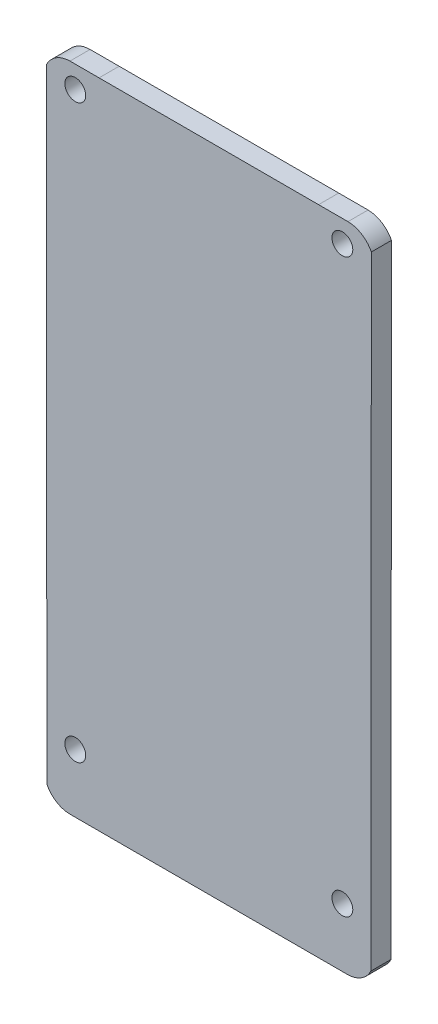
ISO-10303-21;
HEADER;
FILE_DESCRIPTION(('STEP AP214'),'2;1');
FILE_NAME('part.step','',(''),(''),'','','');
FILE_SCHEMA(('AUTOMOTIVE_DESIGN { 1 0 10303 214 1 1 1 1 }'));
ENDSEC;
DATA;
#1=APPLICATION_CONTEXT('core data for automotive mechanical design processes');
#2=APPLICATION_PROTOCOL_DEFINITION('international standard','automotive_design',2000,#1);
#3=PRODUCT_CONTEXT('',#1,'mechanical');
#4=PRODUCT('Part','Part','',(#3));
#5=PRODUCT_RELATED_PRODUCT_CATEGORY('part','',(#4));
#6=PRODUCT_DEFINITION_FORMATION('','',#4);
#7=PRODUCT_DEFINITION_CONTEXT('part definition',#1,'design');
#8=PRODUCT_DEFINITION('design','',#6,#7);
#9=PRODUCT_DEFINITION_SHAPE('','',#8);
#10=(LENGTH_UNIT() NAMED_UNIT(*) SI_UNIT(.MILLI.,.METRE.));
#11=(NAMED_UNIT(*) PLANE_ANGLE_UNIT() SI_UNIT($,.RADIAN.));
#12=(NAMED_UNIT(*) SI_UNIT($,.STERADIAN.) SOLID_ANGLE_UNIT());
#13=UNCERTAINTY_MEASURE_WITH_UNIT(LENGTH_MEASURE(1.E-05),#10,'distance_accuracy_value','');
#14=(GEOMETRIC_REPRESENTATION_CONTEXT(3) GLOBAL_UNCERTAINTY_ASSIGNED_CONTEXT((#13)) GLOBAL_UNIT_ASSIGNED_CONTEXT((#10,
#11,#12)) REPRESENTATION_CONTEXT('',''));
#15=CARTESIAN_POINT('',(0.,0.,0.));
#16=DIRECTION('',(0.,0.,1.));
#17=DIRECTION('',(1.,0.,0.));
#18=AXIS2_PLACEMENT_3D('',#15,#16,#17);
#19=CARTESIAN_POINT('',(0.00942545403528026,44.5705657455995,2.75));
#20=DIRECTION('',(0.000211472609038053,0.999999977639668,0.));
#21=DIRECTION('',(-0.999999977639668,0.000211472609038053,0.));
#22=AXIS2_PLACEMENT_3D('',#19,#20,#21);
#23=PLANE('',#22);
#24=DIRECTION('',(0.999999977639668,-0.000211472609038053,0.));
#25=VECTOR('',#24,1.);
#26=CARTESIAN_POINT('',(0.00942545403528026,44.5705657455995,0.));
#27=LINE('',#26,#25);
#28=CARTESIAN_POINT('',(-15.,44.5737398280314,0.));
#29=VERTEX_POINT('',#28);
#30=CARTESIAN_POINT('',(15.0000089381834,44.5673956477282,0.));
#31=VERTEX_POINT('',#30);
#32=EDGE_CURVE('E151',#29,#31,#27,.T.);
#33=ORIENTED_EDGE('',*,*,#32,.F.);
#34=DIRECTION('',(0.,0.,-1.));
#35=VECTOR('',#34,1.);
#36=CARTESIAN_POINT('',(-15.,44.5737398280314,2.75));
#37=LINE('',#36,#35);
#38=CARTESIAN_POINT('',(-15.,44.5737398280314,2.75));
#39=VERTEX_POINT('',#38);
#40=EDGE_CURVE('E11',#39,#29,#37,.T.);
#41=ORIENTED_EDGE('',*,*,#40,.F.);
#42=DIRECTION('',(0.999999977639668,-0.000211472609038053,0.));
#43=VECTOR('',#42,1.);
#44=CARTESIAN_POINT('',(0.00942545403528026,44.5705657455995,2.75));
#45=LINE('',#44,#43);
#46=CARTESIAN_POINT('',(15.0000089381834,44.5673956477282,2.75));
#47=VERTEX_POINT('',#46);
#48=EDGE_CURVE('E180',#39,#47,#45,.T.);
#49=ORIENTED_EDGE('',*,*,#48,.T.);
#50=DIRECTION('',(0.,0.,-1.));
#51=VECTOR('',#50,1.);
#52=CARTESIAN_POINT('',(15.0000089381834,44.5673956477282,2.75));
#53=LINE('',#52,#51);
#54=EDGE_CURVE('E95',#47,#31,#53,.T.);
#55=ORIENTED_EDGE('',*,*,#54,.T.);
#56=EDGE_LOOP('',(#33,#41,#49,#55));
#57=FACE_BOUND('',#56,.T.);
#58=ADVANCED_FACE('F33',(#57),#23,.T.);
#59=CARTESIAN_POINT('',(0.00108410777632727,44.5733749736325,2.75));
#60=DIRECTION('',(-2.43218687534414E-05,-0.999999999704223,0.));
#61=DIRECTION('',(0.999999999704223,-2.43218687534414E-05,0.));
#62=AXIS2_PLACEMENT_3D('',#59,#60,#61);
#63=PLANE('',#62);
#64=DIRECTION('',(-0.999999999704223,2.43218687534414E-05,0.));
#65=VECTOR('',#64,1.);
#66=CARTESIAN_POINT('',(0.00108410777632727,44.5733749736325,0.));
#67=LINE('',#66,#65);
#68=CARTESIAN_POINT('',(-18.975450835992,44.5738365184249,0.));
#69=VERTEX_POINT('',#68);
#70=EDGE_CURVE('E154',#29,#69,#67,.T.);
#71=ORIENTED_EDGE('',*,*,#70,.T.);
#72=DIRECTION('',(0.,0.,-1.));
#73=VECTOR('',#72,1.);
#74=CARTESIAN_POINT('',(-18.975450835992,44.5738365184249,2.75));
#75=LINE('',#74,#73);
#76=CARTESIAN_POINT('',(-18.975450835992,44.5738365184249,2.75));
#77=VERTEX_POINT('',#76);
#78=EDGE_CURVE('E41',#77,#69,#75,.T.);
#79=ORIENTED_EDGE('',*,*,#78,.F.);
#80=DIRECTION('',(-0.999999999704223,2.43218687534414E-05,0.));
#81=VECTOR('',#80,1.);
#82=CARTESIAN_POINT('',(0.00108410777632727,44.5733749736325,2.75));
#83=LINE('',#82,#81);
#84=EDGE_CURVE('E222',#39,#77,#83,.T.);
#85=ORIENTED_EDGE('',*,*,#84,.F.);
#86=ORIENTED_EDGE('',*,*,#40,.T.);
#87=EDGE_LOOP('',(#71,#79,#85,#86));
#88=FACE_BOUND('',#87,.T.);
#89=ADVANCED_FACE('F285',(#88),#63,.F.);
#90=CARTESIAN_POINT('',(-18.9392064102592,40.9468254740889,2.75));
#91=DIRECTION('',(0.,0.,-1.));
#92=DIRECTION('',(-1.,0.,0.));
#93=AXIS2_PLACEMENT_3D('',#90,#91,#92);
#94=CYLINDRICAL_SURFACE('',#93,3.62719213361129);
#95=CARTESIAN_POINT('',(-18.9392064102592,40.9468254740889,0.));
#96=DIRECTION('',(0.,0.,1.));
#97=DIRECTION('',(1.,0.,0.));
#98=AXIS2_PLACEMENT_3D('',#95,#96,#97);
#99=CIRCLE('',#98,3.62719213361129);
#100=CARTESIAN_POINT('',(-22.1812519703787,42.573375,0.));
#101=VERTEX_POINT('',#100);
#102=EDGE_CURVE('E157',#69,#101,#99,.T.);
#103=ORIENTED_EDGE('',*,*,#102,.T.);
#104=DIRECTION('',(0.,0.,-1.));
#105=VECTOR('',#104,1.);
#106=CARTESIAN_POINT('',(-22.1812519703787,42.573375,2.75));
#107=LINE('',#106,#105);
#108=CARTESIAN_POINT('',(-22.1812519703787,42.573375,2.75));
#109=VERTEX_POINT('',#108);
#110=EDGE_CURVE('E196',#109,#101,#107,.T.);
#111=ORIENTED_EDGE('',*,*,#110,.F.);
#112=CARTESIAN_POINT('',(-18.9392064102592,40.9468254740889,2.75));
#113=DIRECTION('',(0.,0.,1.));
#114=DIRECTION('',(1.,0.,0.));
#115=AXIS2_PLACEMENT_3D('',#112,#113,#114);
#116=CIRCLE('',#115,3.62719213361129);
#117=EDGE_CURVE('E204',#77,#109,#116,.T.);
#118=ORIENTED_EDGE('',*,*,#117,.F.);
#119=ORIENTED_EDGE('',*,*,#78,.T.);
#120=EDGE_LOOP('',(#103,#111,#118,#119));
#121=FACE_BOUND('',#120,.T.);
#122=ADVANCED_FACE('F202',(#121),#94,.T.);
#123=CARTESIAN_POINT('',(-22.1603076453313,-0.0108991569226361,2.75));
#124=DIRECTION('',(-0.999999879050475,-0.000491832323757672,0.));
#125=DIRECTION('',(0.000491832323757672,-0.999999879050475,0.));
#126=AXIS2_PLACEMENT_3D('',#123,#124,#125);
#127=PLANE('',#126);
#128=DIRECTION('',(-0.000491832323757672,0.999999879050475,0.));
#129=VECTOR('',#128,1.);
#130=CARTESIAN_POINT('',(-22.1603076453313,-0.0108991569226361,0.));
#131=LINE('',#130,#129);
#132=CARTESIAN_POINT('',(-22.1393740414006,-42.5733749999999,0.));
#133=VERTEX_POINT('',#132);
#134=EDGE_CURVE('E160',#133,#101,#131,.T.);
#135=ORIENTED_EDGE('',*,*,#134,.F.);
#136=DIRECTION('',(0.,0.,-1.));
#137=VECTOR('',#136,1.);
#138=CARTESIAN_POINT('',(-22.1393740414006,-42.5733749999999,2.75));
#139=LINE('',#138,#137);
#140=CARTESIAN_POINT('',(-22.1393740414006,-42.5733749999999,2.75));
#141=VERTEX_POINT('',#140);
#142=EDGE_CURVE('E194',#141,#133,#139,.T.);
#143=ORIENTED_EDGE('',*,*,#142,.F.);
#144=DIRECTION('',(-0.000491832323757672,0.999999879050475,0.));
#145=VECTOR('',#144,1.);
#146=CARTESIAN_POINT('',(-22.1603076453313,-0.0108991569226361,2.75));
#147=LINE('',#146,#145);
#148=EDGE_CURVE('E217',#141,#109,#147,.T.);
#149=ORIENTED_EDGE('',*,*,#148,.T.);
#150=ORIENTED_EDGE('',*,*,#110,.T.);
#151=EDGE_LOOP('',(#135,#143,#149,#150));
#152=FACE_BOUND('',#151,.T.);
#153=ADVANCED_FACE('F213',(#152),#127,.T.);
#154=CARTESIAN_POINT('',(-18.9484000676842,-41.0146668184599,2.75));
#155=DIRECTION('',(0.,0.,-1.));
#156=DIRECTION('',(-1.,0.,0.));
#157=AXIS2_PLACEMENT_3D('',#154,#155,#156);
#158=CYLINDRICAL_SURFACE('',#157,3.55132173931556);
#159=CARTESIAN_POINT('',(-18.9484000676842,-41.0146668184599,0.));
#160=DIRECTION('',(0.,0.,1.));
#161=DIRECTION('',(1.,0.,0.));
#162=AXIS2_PLACEMENT_3D('',#159,#160,#161);
#163=CIRCLE('',#162,3.55132173931556);
#164=CARTESIAN_POINT('',(-19.0263549543839,-44.5651328627666,0.));
#165=VERTEX_POINT('',#164);
#166=EDGE_CURVE('E163',#133,#165,#163,.T.);
#167=ORIENTED_EDGE('',*,*,#166,.T.);
#168=DIRECTION('',(0.,0.,-1.));
#169=VECTOR('',#168,1.);
#170=CARTESIAN_POINT('',(-19.0263549543839,-44.5651328627666,2.75));
#171=LINE('',#170,#169);
#172=CARTESIAN_POINT('',(-19.0263549543839,-44.5651328627666,2.75));
#173=VERTEX_POINT('',#172);
#174=EDGE_CURVE('E191',#173,#165,#171,.T.);
#175=ORIENTED_EDGE('',*,*,#174,.F.);
#176=CARTESIAN_POINT('',(-18.9484000676842,-41.0146668184599,2.75));
#177=DIRECTION('',(0.,0.,1.));
#178=DIRECTION('',(1.,0.,0.));
#179=AXIS2_PLACEMENT_3D('',#176,#177,#178);
#180=CIRCLE('',#179,3.55132173931556);
#181=EDGE_CURVE('E218',#141,#173,#180,.T.);
#182=ORIENTED_EDGE('',*,*,#181,.F.);
#183=ORIENTED_EDGE('',*,*,#142,.T.);
#184=EDGE_LOOP('',(#167,#175,#182,#183));
#185=FACE_BOUND('',#184,.T.);
#186=ADVANCED_FACE('F296',(#185),#158,.T.);
#187=CARTESIAN_POINT('',(-0.0193142943323028,-44.57336889219,2.75));
#188=DIRECTION('',(0.000433314622589495,0.999999906119215,0.));
#189=DIRECTION('',(-0.999999906119215,0.000433314622589495,0.));
#190=AXIS2_PLACEMENT_3D('',#187,#188,#189);
#191=PLANE('',#190);
#192=DIRECTION('',(0.999999906119215,-0.000433314622589495,0.));
#193=VECTOR('',#192,1.);
#194=CARTESIAN_POINT('',(-0.0193142943323028,-44.57336889219,0.));
#195=LINE('',#194,#193);
#196=CARTESIAN_POINT('',(-15.0000105699398,-44.5668775368278,0.));
#197=VERTEX_POINT('',#196);
#198=EDGE_CURVE('E165',#165,#197,#195,.T.);
#199=ORIENTED_EDGE('',*,*,#198,.T.);
#200=DIRECTION('',(0.,0.,-1.));
#201=VECTOR('',#200,1.);
#202=CARTESIAN_POINT('',(-15.0000105699398,-44.5668775368278,2.75));
#203=LINE('',#202,#201);
#204=CARTESIAN_POINT('',(-15.0000105699398,-44.5668775368278,2.75));
#205=VERTEX_POINT('',#204);
#206=EDGE_CURVE('E189',#205,#197,#203,.T.);
#207=ORIENTED_EDGE('',*,*,#206,.F.);
#208=DIRECTION('',(0.999999906119215,-0.000433314622589495,0.));
#209=VECTOR('',#208,1.);
#210=CARTESIAN_POINT('',(-0.0193142943323028,-44.57336889219,2.75));
#211=LINE('',#210,#209);
#212=EDGE_CURVE('E220',#173,#205,#211,.T.);
#213=ORIENTED_EDGE('',*,*,#212,.F.);
#214=ORIENTED_EDGE('',*,*,#174,.T.);
#215=EDGE_LOOP('',(#199,#207,#213,#214));
#216=FACE_BOUND('',#215,.T.);
#217=ADVANCED_FACE('F299',(#216),#191,.F.);
#218=CARTESIAN_POINT('',(-0.00942534446911136,-44.5700476350673,2.75));
#219=DIRECTION('',(-0.000211472609038491,-0.999999977639668,0.));
#220=DIRECTION('',(0.999999977639668,-0.000211472609038491,0.));
#221=AXIS2_PLACEMENT_3D('',#218,#219,#220);
#222=PLANE('',#221);
#223=DIRECTION('',(-0.999999977639668,0.000211472609038491,0.));
#224=VECTOR('',#223,1.);
#225=CARTESIAN_POINT('',(-0.00942534446911136,-44.5700476350673,0.));
#226=LINE('',#225,#224);
#227=CARTESIAN_POINT('',(15.0000000058739,-44.5732217174773,0.));
#228=VERTEX_POINT('',#227);
#229=EDGE_CURVE('E168',#228,#197,#226,.T.);
#230=ORIENTED_EDGE('',*,*,#229,.F.);
#231=DIRECTION('',(0.,0.,-1.));
#232=VECTOR('',#231,1.);
#233=CARTESIAN_POINT('',(15.0000000058739,-44.5732217174773,2.75));
#234=LINE('',#233,#232);
#235=CARTESIAN_POINT('',(15.0000000058739,-44.5732217174773,2.75));
#236=VERTEX_POINT('',#235);
#237=EDGE_CURVE('E187',#236,#228,#234,.T.);
#238=ORIENTED_EDGE('',*,*,#237,.F.);
#239=DIRECTION('',(-0.999999977639668,0.000211472609038491,0.));
#240=VECTOR('',#239,1.);
#241=CARTESIAN_POINT('',(-0.00942534446911136,-44.5700476350673,2.75));
#242=LINE('',#241,#240);
#243=EDGE_CURVE('E227',#236,#205,#242,.T.);
#244=ORIENTED_EDGE('',*,*,#243,.T.);
#245=ORIENTED_EDGE('',*,*,#206,.T.);
#246=EDGE_LOOP('',(#230,#238,#244,#245));
#247=FACE_BOUND('',#246,.T.);
#248=ADVANCED_FACE('F303',(#247),#222,.T.);
#249=CARTESIAN_POINT('',(0.00045548795726477,-44.5733749953454,2.75));
#250=DIRECTION('',(-1.02188348378052E-05,0.999999999947788,0.));
#251=DIRECTION('',(-0.999999999947788,-1.02188348378052E-05,0.));
#252=AXIS2_PLACEMENT_3D('',#249,#250,#251);
#253=PLANE('',#252);
#254=DIRECTION('',(0.999999999947788,1.02188348378052E-05,0.));
#255=VECTOR('',#254,1.);
#256=CARTESIAN_POINT('',(0.00045548795726477,-44.5733749953454,0.));
#257=LINE('',#256,#255);
#258=CARTESIAN_POINT('',(19.026379978421,-44.5731805725654,0.));
#259=VERTEX_POINT('',#258);
#260=EDGE_CURVE('E171',#228,#259,#257,.T.);
#261=ORIENTED_EDGE('',*,*,#260,.T.);
#262=DIRECTION('',(0.,0.,-1.));
#263=VECTOR('',#262,1.);
#264=CARTESIAN_POINT('',(19.026379978421,-44.5731805725654,2.75));
#265=LINE('',#264,#263);
#266=CARTESIAN_POINT('',(19.026379978421,-44.5731805725654,2.75));
#267=VERTEX_POINT('',#266);
#268=EDGE_CURVE('E184',#267,#259,#265,.T.);
#269=ORIENTED_EDGE('',*,*,#268,.F.);
#270=DIRECTION('',(0.999999999947788,1.02188348378052E-05,0.));
#271=VECTOR('',#270,1.);
#272=CARTESIAN_POINT('',(0.00045548795726477,-44.5733749953454,2.75));
#273=LINE('',#272,#271);
#274=EDGE_CURVE('E146',#236,#267,#273,.T.);
#275=ORIENTED_EDGE('',*,*,#274,.F.);
#276=ORIENTED_EDGE('',*,*,#237,.T.);
#277=EDGE_LOOP('',(#261,#269,#275,#276));
#278=FACE_BOUND('',#277,.T.);
#279=ADVANCED_FACE('F233',(#278),#253,.F.);
#280=CARTESIAN_POINT('',(18.9499074828976,-41.0226823511819,2.75));
#281=DIRECTION('',(0.,0.,-1.));
#282=DIRECTION('',(-1.,0.,0.));
#283=AXIS2_PLACEMENT_3D('',#280,#281,#282);
#284=CYLINDRICAL_SURFACE('',#283,3.55132167827963);
#285=CARTESIAN_POINT('',(18.9499074828976,-41.0226823511819,0.));
#286=DIRECTION('',(0.,0.,1.));
#287=DIRECTION('',(1.,0.,0.));
#288=AXIS2_PLACEMENT_3D('',#285,#286,#287);
#289=CIRCLE('',#288,3.55132167827963);
#290=CARTESIAN_POINT('',(22.1447843148772,-42.5733749999999,0.));
#291=VERTEX_POINT('',#290);
#292=EDGE_CURVE('E173',#259,#291,#289,.T.);
#293=ORIENTED_EDGE('',*,*,#292,.T.);
#294=DIRECTION('',(0.,0.,-1.));
#295=VECTOR('',#294,1.);
#296=CARTESIAN_POINT('',(22.1447843148772,-42.5733749999999,2.75));
#297=LINE('',#296,#295);
#298=CARTESIAN_POINT('',(22.1447843148772,-42.5733749999999,2.75));
#299=VERTEX_POINT('',#298);
#300=EDGE_CURVE('E135',#299,#291,#297,.T.);
#301=ORIENTED_EDGE('',*,*,#300,.F.);
#302=CARTESIAN_POINT('',(18.9499074828976,-41.0226823511819,2.75));
#303=DIRECTION('',(0.,0.,1.));
#304=DIRECTION('',(1.,0.,0.));
#305=AXIS2_PLACEMENT_3D('',#302,#303,#304);
#306=CIRCLE('',#305,3.55132167827963);
#307=EDGE_CURVE('E143',#267,#299,#306,.T.);
#308=ORIENTED_EDGE('',*,*,#307,.F.);
#309=ORIENTED_EDGE('',*,*,#268,.T.);
#310=EDGE_LOOP('',(#293,#301,#308,#309));
#311=FACE_BOUND('',#310,.T.);
#312=ADVANCED_FACE('F237',(#311),#284,.T.);
#313=CARTESIAN_POINT('',(22.1786781618883,-0.0176643913067051,2.75));
#314=DIRECTION('',(0.999999682827275,-0.000796458002370779,0.));
#315=DIRECTION('',(0.000796458002370779,0.999999682827275,0.));
#316=AXIS2_PLACEMENT_3D('',#313,#314,#315);
#317=PLANE('',#316);
#318=DIRECTION('',(-0.000796458002370779,-0.999999682827275,0.));
#319=VECTOR('',#318,1.);
#320=CARTESIAN_POINT('',(22.1786781618883,-0.0176643913067051,0.));
#321=LINE('',#320,#319);
#322=CARTESIAN_POINT('',(22.2126001467999,42.573375,0.));
#323=VERTEX_POINT('',#322);
#324=EDGE_CURVE('E134',#323,#291,#321,.T.);
#325=ORIENTED_EDGE('',*,*,#324,.F.);
#326=DIRECTION('',(0.,0.,-1.));
#327=VECTOR('',#326,1.);
#328=CARTESIAN_POINT('',(22.2126001467999,42.573375,2.75));
#329=LINE('',#328,#327);
#330=CARTESIAN_POINT('',(22.2126001467999,42.573375,2.75));
#331=VERTEX_POINT('',#330);
#332=EDGE_CURVE('E128',#331,#323,#329,.T.);
#333=ORIENTED_EDGE('',*,*,#332,.F.);
#334=DIRECTION('',(-0.000796458002370779,-0.999999682827275,0.));
#335=VECTOR('',#334,1.);
#336=CARTESIAN_POINT('',(22.1786781618883,-0.0176643913067051,2.75));
#337=LINE('',#336,#335);
#338=EDGE_CURVE('E132',#331,#299,#337,.T.);
#339=ORIENTED_EDGE('',*,*,#338,.T.);
#340=ORIENTED_EDGE('',*,*,#300,.T.);
#341=EDGE_LOOP('',(#325,#333,#339,#340));
#342=FACE_BOUND('',#341,.T.);
#343=ADVANCED_FACE('F130',(#342),#317,.T.);
#344=CARTESIAN_POINT('',(18.9745936732691,40.9388019134865,2.75));
#345=DIRECTION('',(0.,0.,-1.));
#346=DIRECTION('',(-1.,0.,0.));
#347=AXIS2_PLACEMENT_3D('',#344,#345,#346);
#348=CYLINDRICAL_SURFACE('',#347,3.6271910754441);
#349=CARTESIAN_POINT('',(18.9745936732691,40.9388019134865,0.));
#350=DIRECTION('',(0.,0.,1.));
#351=DIRECTION('',(1.,0.,0.));
#352=AXIS2_PLACEMENT_3D('',#349,#350,#351);
#353=CIRCLE('',#352,3.6271910754441);
#354=CARTESIAN_POINT('',(19.0123740493778,44.5657962257184,0.));
#355=VERTEX_POINT('',#354);
#356=EDGE_CURVE('E88',#323,#355,#353,.T.);
#357=ORIENTED_EDGE('',*,*,#356,.T.);
#358=DIRECTION('',(0.,0.,-1.));
#359=VECTOR('',#358,1.);
#360=CARTESIAN_POINT('',(19.0123740493778,44.5657962257184,2.75));
#361=LINE('',#360,#359);
#362=CARTESIAN_POINT('',(19.0123740493778,44.5657962257184,2.75));
#363=VERTEX_POINT('',#362);
#364=EDGE_CURVE('E136',#363,#355,#361,.T.);
#365=ORIENTED_EDGE('',*,*,#364,.F.);
#366=CARTESIAN_POINT('',(18.9745936732691,40.9388019134865,2.75));
#367=DIRECTION('',(0.,0.,1.));
#368=DIRECTION('',(1.,0.,0.));
#369=AXIS2_PLACEMENT_3D('',#366,#367,#368);
#370=CIRCLE('',#369,3.6271910754441);
#371=EDGE_CURVE('E138',#331,#363,#370,.T.);
#372=ORIENTED_EDGE('',*,*,#371,.F.);
#373=ORIENTED_EDGE('',*,*,#332,.T.);
#374=EDGE_LOOP('',(#357,#365,#372,#373));
#375=FACE_BOUND('',#374,.T.);
#376=ADVANCED_FACE('F139',(#375),#348,.T.);
#377=CARTESIAN_POINT('',(0.0177679806602312,44.5733679172698,2.75));
#378=DIRECTION('',(-0.000398623215583329,-0.999999920549763,0.));
#379=DIRECTION('',(0.999999920549763,-0.000398623215583329,0.));
#380=AXIS2_PLACEMENT_3D('',#377,#378,#379);
#381=PLANE('',#380);
#382=DIRECTION('',(-0.999999920549763,0.000398623215583329,0.));
#383=VECTOR('',#382,1.);
#384=CARTESIAN_POINT('',(0.0177679806602312,44.5733679172698,0.));
#385=LINE('',#384,#383);
#386=EDGE_CURVE('E178',#355,#31,#385,.T.);
#387=ORIENTED_EDGE('',*,*,#386,.T.);
#388=ORIENTED_EDGE('',*,*,#54,.F.);
#389=DIRECTION('',(-0.999999920549763,0.000398623215583329,0.));
#390=VECTOR('',#389,1.);
#391=CARTESIAN_POINT('',(0.0177679806602312,44.5733679172698,2.75));
#392=LINE('',#391,#390);
#393=EDGE_CURVE('E49',#363,#47,#392,.T.);
#394=ORIENTED_EDGE('',*,*,#393,.F.);
#395=ORIENTED_EDGE('',*,*,#364,.T.);
#396=EDGE_LOOP('',(#387,#388,#394,#395));
#397=FACE_BOUND('',#396,.T.);
#398=ADVANCED_FACE('F240',(#397),#381,.F.);
#399=CARTESIAN_POINT('',(0.,0.,2.75));
#400=DIRECTION('',(0.,0.,1.));
#401=DIRECTION('',(1.,0.,0.));
#402=AXIS2_PLACEMENT_3D('',#399,#400,#401);
#403=PLANE('',#402);
#404=CARTESIAN_POINT('',(-18.25,-36.5342037742816,2.75));
#405=DIRECTION('',(0.,0.,1.));
#406=DIRECTION('',(1.,0.,0.));
#407=AXIS2_PLACEMENT_3D('',#404,#405,#406);
#408=CIRCLE('',#407,1.425);
#409=CARTESIAN_POINT('',(-16.825,-36.5342037742816,2.75));
#410=VERTEX_POINT('',#409);
#411=EDGE_CURVE('E155',#410,#410,#408,.T.);
#412=ORIENTED_EDGE('',*,*,#411,.F.);
#413=EDGE_LOOP('',(#412));
#414=FACE_BOUND('',#413,.T.);
#415=CARTESIAN_POINT('',(18.25,-36.5342037742816,2.75));
#416=DIRECTION('',(0.,0.,1.));
#417=DIRECTION('',(1.,0.,0.));
#418=AXIS2_PLACEMENT_3D('',#415,#416,#417);
#419=CIRCLE('',#418,1.425);
#420=CARTESIAN_POINT('',(19.675,-36.5342037742816,2.75));
#421=VERTEX_POINT('',#420);
#422=EDGE_CURVE('E245',#421,#421,#419,.T.);
#423=ORIENTED_EDGE('',*,*,#422,.F.);
#424=EDGE_LOOP('',(#423));
#425=FACE_BOUND('',#424,.T.);
#426=CARTESIAN_POINT('',(18.25,41.5657962257184,2.75));
#427=DIRECTION('',(0.,0.,1.));
#428=DIRECTION('',(1.,0.,0.));
#429=AXIS2_PLACEMENT_3D('',#426,#427,#428);
#430=CIRCLE('',#429,1.425);
#431=CARTESIAN_POINT('',(19.675,41.5657962257184,2.75));
#432=VERTEX_POINT('',#431);
#433=EDGE_CURVE('E248',#432,#432,#430,.T.);
#434=ORIENTED_EDGE('',*,*,#433,.F.);
#435=EDGE_LOOP('',(#434));
#436=FACE_BOUND('',#435,.T.);
#437=CARTESIAN_POINT('',(-18.25,41.5657962257184,2.75));
#438=DIRECTION('',(0.,0.,1.));
#439=DIRECTION('',(1.,0.,0.));
#440=AXIS2_PLACEMENT_3D('',#437,#438,#439);
#441=CIRCLE('',#440,1.425);
#442=CARTESIAN_POINT('',(-16.825,41.5657962257184,2.75));
#443=VERTEX_POINT('',#442);
#444=EDGE_CURVE('E251',#443,#443,#441,.T.);
#445=ORIENTED_EDGE('',*,*,#444,.F.);
#446=EDGE_LOOP('',(#445));
#447=FACE_BOUND('',#446,.T.);
#448=ORIENTED_EDGE('',*,*,#48,.F.);
#449=ORIENTED_EDGE('',*,*,#84,.T.);
#450=ORIENTED_EDGE('',*,*,#117,.T.);
#451=ORIENTED_EDGE('',*,*,#148,.F.);
#452=ORIENTED_EDGE('',*,*,#181,.T.);
#453=ORIENTED_EDGE('',*,*,#212,.T.);
#454=ORIENTED_EDGE('',*,*,#243,.F.);
#455=ORIENTED_EDGE('',*,*,#274,.T.);
#456=ORIENTED_EDGE('',*,*,#307,.T.);
#457=ORIENTED_EDGE('',*,*,#338,.F.);
#458=ORIENTED_EDGE('',*,*,#371,.T.);
#459=ORIENTED_EDGE('',*,*,#393,.T.);
#460=EDGE_LOOP('',(#448,#449,#450,#451,#452,#453,#454,#455,#456,#457,#458,#459));
#461=FACE_BOUND('',#460,.T.);
#462=ADVANCED_FACE('F141',(#414,#425,#436,#447,#461),#403,.T.);
#463=CARTESIAN_POINT('',(0.,0.,0.));
#464=DIRECTION('',(0.,0.,1.));
#465=DIRECTION('',(1.,0.,0.));
#466=AXIS2_PLACEMENT_3D('',#463,#464,#465);
#467=PLANE('',#466);
#468=CARTESIAN_POINT('',(-18.25,-36.5342037742816,0.));
#469=DIRECTION('',(0.,0.,1.));
#470=DIRECTION('',(1.,0.,0.));
#471=AXIS2_PLACEMENT_3D('',#468,#469,#470);
#472=CIRCLE('',#471,1.425);
#473=CARTESIAN_POINT('',(-16.825,-36.5342037742816,0.));
#474=VERTEX_POINT('',#473);
#475=EDGE_CURVE('E258',#474,#474,#472,.T.);
#476=ORIENTED_EDGE('',*,*,#475,.T.);
#477=EDGE_LOOP('',(#476));
#478=FACE_BOUND('',#477,.T.);
#479=CARTESIAN_POINT('',(18.25,-36.5342037742816,0.));
#480=DIRECTION('',(0.,0.,1.));
#481=DIRECTION('',(1.,0.,0.));
#482=AXIS2_PLACEMENT_3D('',#479,#480,#481);
#483=CIRCLE('',#482,1.425);
#484=CARTESIAN_POINT('',(19.675,-36.5342037742816,0.));
#485=VERTEX_POINT('',#484);
#486=EDGE_CURVE('E261',#485,#485,#483,.T.);
#487=ORIENTED_EDGE('',*,*,#486,.T.);
#488=EDGE_LOOP('',(#487));
#489=FACE_BOUND('',#488,.T.);
#490=CARTESIAN_POINT('',(18.25,41.5657962257184,0.));
#491=DIRECTION('',(0.,0.,1.));
#492=DIRECTION('',(1.,0.,0.));
#493=AXIS2_PLACEMENT_3D('',#490,#491,#492);
#494=CIRCLE('',#493,1.425);
#495=CARTESIAN_POINT('',(19.675,41.5657962257184,0.));
#496=VERTEX_POINT('',#495);
#497=EDGE_CURVE('E257',#496,#496,#494,.T.);
#498=ORIENTED_EDGE('',*,*,#497,.T.);
#499=EDGE_LOOP('',(#498));
#500=FACE_BOUND('',#499,.T.);
#501=CARTESIAN_POINT('',(-18.25,41.5657962257184,0.));
#502=DIRECTION('',(0.,0.,1.));
#503=DIRECTION('',(1.,0.,0.));
#504=AXIS2_PLACEMENT_3D('',#501,#502,#503);
#505=CIRCLE('',#504,1.425);
#506=CARTESIAN_POINT('',(-16.825,41.5657962257184,0.));
#507=VERTEX_POINT('',#506);
#508=EDGE_CURVE('E254',#507,#507,#505,.T.);
#509=ORIENTED_EDGE('',*,*,#508,.T.);
#510=EDGE_LOOP('',(#509));
#511=FACE_BOUND('',#510,.T.);
#512=ORIENTED_EDGE('',*,*,#32,.T.);
#513=ORIENTED_EDGE('',*,*,#386,.F.);
#514=ORIENTED_EDGE('',*,*,#356,.F.);
#515=ORIENTED_EDGE('',*,*,#324,.T.);
#516=ORIENTED_EDGE('',*,*,#292,.F.);
#517=ORIENTED_EDGE('',*,*,#260,.F.);
#518=ORIENTED_EDGE('',*,*,#229,.T.);
#519=ORIENTED_EDGE('',*,*,#198,.F.);
#520=ORIENTED_EDGE('',*,*,#166,.F.);
#521=ORIENTED_EDGE('',*,*,#134,.T.);
#522=ORIENTED_EDGE('',*,*,#102,.F.);
#523=ORIENTED_EDGE('',*,*,#70,.F.);
#524=EDGE_LOOP('',(#512,#513,#514,#515,#516,#517,#518,#519,#520,#521,#522,#523));
#525=FACE_BOUND('',#524,.T.);
#526=ADVANCED_FACE('F208',(#478,#489,#500,#511,#525),#467,.F.);
#527=CARTESIAN_POINT('',(-18.25,41.5657962257184,0.));
#528=DIRECTION('',(0.,0.,1.));
#529=DIRECTION('',(1.,0.,0.));
#530=AXIS2_PLACEMENT_3D('',#527,#528,#529);
#531=CYLINDRICAL_SURFACE('',#530,1.425);
#532=ORIENTED_EDGE('',*,*,#444,.T.);
#533=EDGE_LOOP('',(#532));
#534=FACE_BOUND('',#533,.T.);
#535=ORIENTED_EDGE('',*,*,#508,.F.);
#536=EDGE_LOOP('',(#535));
#537=FACE_BOUND('',#536,.T.);
#538=ADVANCED_FACE('F272',(#534,#537),#531,.F.);
#539=CARTESIAN_POINT('',(18.25,41.5657962257184,0.));
#540=DIRECTION('',(0.,0.,1.));
#541=DIRECTION('',(1.,0.,0.));
#542=AXIS2_PLACEMENT_3D('',#539,#540,#541);
#543=CYLINDRICAL_SURFACE('',#542,1.425);
#544=ORIENTED_EDGE('',*,*,#433,.T.);
#545=EDGE_LOOP('',(#544));
#546=FACE_BOUND('',#545,.T.);
#547=ORIENTED_EDGE('',*,*,#497,.F.);
#548=EDGE_LOOP('',(#547));
#549=FACE_BOUND('',#548,.T.);
#550=ADVANCED_FACE('F269',(#546,#549),#543,.F.);
#551=CARTESIAN_POINT('',(18.25,-36.5342037742816,0.));
#552=DIRECTION('',(0.,0.,1.));
#553=DIRECTION('',(1.,0.,0.));
#554=AXIS2_PLACEMENT_3D('',#551,#552,#553);
#555=CYLINDRICAL_SURFACE('',#554,1.425);
#556=ORIENTED_EDGE('',*,*,#422,.T.);
#557=EDGE_LOOP('',(#556));
#558=FACE_BOUND('',#557,.T.);
#559=ORIENTED_EDGE('',*,*,#486,.F.);
#560=EDGE_LOOP('',(#559));
#561=FACE_BOUND('',#560,.T.);
#562=ADVANCED_FACE('F271',(#558,#561),#555,.F.);
#563=CARTESIAN_POINT('',(-18.25,-36.5342037742816,0.));
#564=DIRECTION('',(0.,0.,1.));
#565=DIRECTION('',(1.,0.,0.));
#566=AXIS2_PLACEMENT_3D('',#563,#564,#565);
#567=CYLINDRICAL_SURFACE('',#566,1.425);
#568=ORIENTED_EDGE('',*,*,#411,.T.);
#569=EDGE_LOOP('',(#568));
#570=FACE_BOUND('',#569,.T.);
#571=ORIENTED_EDGE('',*,*,#475,.F.);
#572=EDGE_LOOP('',(#571));
#573=FACE_BOUND('',#572,.T.);
#574=ADVANCED_FACE('F279',(#570,#573),#567,.F.);
#575=CLOSED_SHELL('',(#58,#89,#122,#153,#186,#217,#248,#279,#312,#343,#376,#398,#462,#526,#538,
#550,#562,#574));
#576=MANIFOLD_SOLID_BREP('B2',#575);
#577=ADVANCED_BREP_SHAPE_REPRESENTATION('',(#18,#576),#14);
#578=SHAPE_DEFINITION_REPRESENTATION(#9,#577);
ENDSEC;
END-ISO-10303-21;
